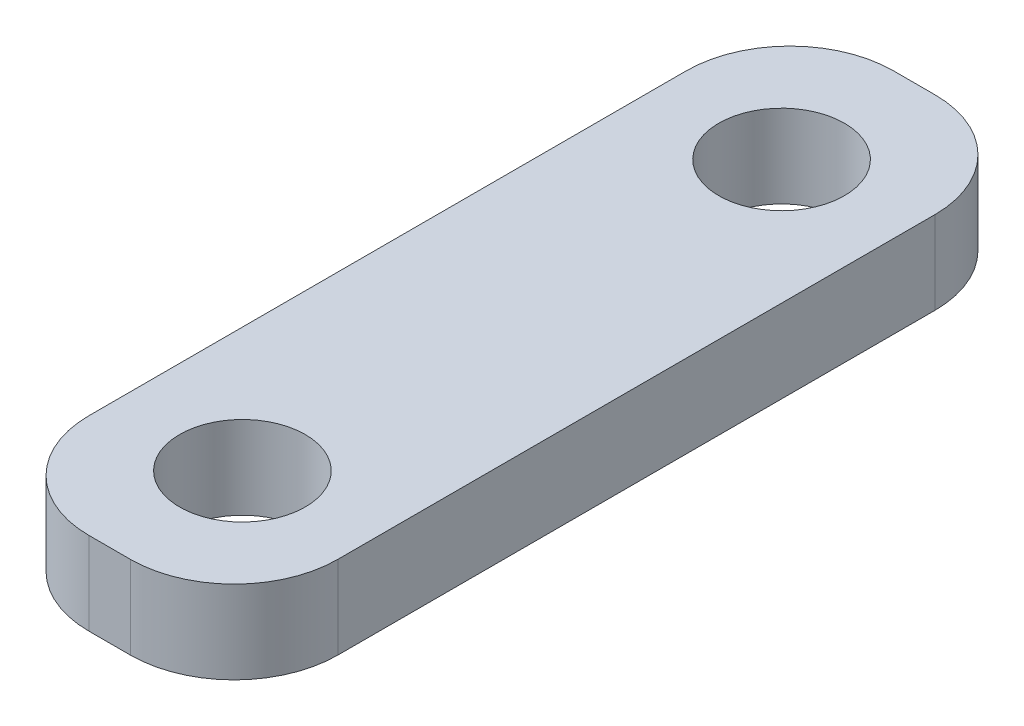
ISO-10303-21;
HEADER;
FILE_DESCRIPTION(('STEP AP214'),'2;1');
FILE_NAME('part.step','',(''),(''),'','','');
FILE_SCHEMA(('AUTOMOTIVE_DESIGN { 1 0 10303 214 1 1 1 1 }'));
ENDSEC;
DATA;
#1=APPLICATION_CONTEXT('core data for automotive mechanical design processes');
#2=APPLICATION_PROTOCOL_DEFINITION('international standard','automotive_design',2000,#1);
#3=PRODUCT_CONTEXT('',#1,'mechanical');
#4=PRODUCT('Part','Part','',(#3));
#5=PRODUCT_RELATED_PRODUCT_CATEGORY('part','',(#4));
#6=PRODUCT_DEFINITION_FORMATION('','',#4);
#7=PRODUCT_DEFINITION_CONTEXT('part definition',#1,'design');
#8=PRODUCT_DEFINITION('design','',#6,#7);
#9=PRODUCT_DEFINITION_SHAPE('','',#8);
#10=(LENGTH_UNIT() NAMED_UNIT(*) SI_UNIT(.MILLI.,.METRE.));
#11=(NAMED_UNIT(*) PLANE_ANGLE_UNIT() SI_UNIT($,.RADIAN.));
#12=(NAMED_UNIT(*) SI_UNIT($,.STERADIAN.) SOLID_ANGLE_UNIT());
#13=UNCERTAINTY_MEASURE_WITH_UNIT(LENGTH_MEASURE(1.E-05),#10,'distance_accuracy_value','');
#14=(GEOMETRIC_REPRESENTATION_CONTEXT(3) GLOBAL_UNCERTAINTY_ASSIGNED_CONTEXT((#13)) GLOBAL_UNIT_ASSIGNED_CONTEXT((#10,
#11,#12)) REPRESENTATION_CONTEXT('',''));
#15=CARTESIAN_POINT('',(0.,0.,0.));
#16=DIRECTION('',(0.,0.,1.));
#17=DIRECTION('',(1.,0.,0.));
#18=AXIS2_PLACEMENT_3D('',#15,#16,#17);
#19=CARTESIAN_POINT('',(0.,2.,0.));
#20=DIRECTION('',(0.,-1.,0.));
#21=DIRECTION('',(0.,0.,1.));
#22=AXIS2_PLACEMENT_3D('',#19,#20,#21);
#23=PLANE('',#22);
#24=DIRECTION('',(1.,0.,0.));
#25=VECTOR('',#24,1.);
#26=CARTESIAN_POINT('',(0.,2.,0.));
#27=LINE('',#26,#25);
#28=CARTESIAN_POINT('',(2.5,2.,0.));
#29=VERTEX_POINT('',#28);
#30=CARTESIAN_POINT('',(3.5,2.,0.));
#31=VERTEX_POINT('',#30);
#32=EDGE_CURVE('E189',#29,#31,#27,.T.);
#33=ORIENTED_EDGE('',*,*,#32,.F.);
#34=CARTESIAN_POINT('',(2.5,2.,2.5));
#35=DIRECTION('',(0.,1.,0.));
#36=DIRECTION('',(0.,0.,1.));
#37=AXIS2_PLACEMENT_3D('',#34,#35,#36);
#38=CIRCLE('',#37,2.5);
#39=CARTESIAN_POINT('',(0.,2.,2.5));
#40=VERTEX_POINT('',#39);
#41=EDGE_CURVE('E176',#40,#29,#38,.F.);
#42=ORIENTED_EDGE('',*,*,#41,.F.);
#43=DIRECTION('',(0.,0.,-1.));
#44=VECTOR('',#43,1.);
#45=CARTESIAN_POINT('',(0.,2.,0.));
#46=LINE('',#45,#44);
#47=CARTESIAN_POINT('',(0.,2.,16.9));
#48=VERTEX_POINT('',#47);
#49=EDGE_CURVE('E148',#48,#40,#46,.T.);
#50=ORIENTED_EDGE('',*,*,#49,.F.);
#51=CARTESIAN_POINT('',(2.5,2.,16.9));
#52=DIRECTION('',(0.,1.,0.));
#53=DIRECTION('',(0.,0.,1.));
#54=AXIS2_PLACEMENT_3D('',#51,#52,#53);
#55=CIRCLE('',#54,2.5);
#56=CARTESIAN_POINT('',(2.5,2.,19.4));
#57=VERTEX_POINT('',#56);
#58=EDGE_CURVE('E170',#57,#48,#55,.F.);
#59=ORIENTED_EDGE('',*,*,#58,.F.);
#60=DIRECTION('',(-1.,0.,0.));
#61=VECTOR('',#60,1.);
#62=CARTESIAN_POINT('',(0.,2.,19.4));
#63=LINE('',#62,#61);
#64=CARTESIAN_POINT('',(3.5,2.,19.4));
#65=VERTEX_POINT('',#64);
#66=EDGE_CURVE('E156',#65,#57,#63,.T.);
#67=ORIENTED_EDGE('',*,*,#66,.F.);
#68=CARTESIAN_POINT('',(3.5,2.,16.9));
#69=DIRECTION('',(0.,1.,0.));
#70=DIRECTION('',(0.,0.,1.));
#71=AXIS2_PLACEMENT_3D('',#68,#69,#70);
#72=CIRCLE('',#71,2.5);
#73=CARTESIAN_POINT('',(6.,2.,16.9));
#74=VERTEX_POINT('',#73);
#75=EDGE_CURVE('E173',#74,#65,#72,.F.);
#76=ORIENTED_EDGE('',*,*,#75,.F.);
#77=DIRECTION('',(0.,0.,1.));
#78=VECTOR('',#77,1.);
#79=CARTESIAN_POINT('',(6.,2.,0.));
#80=LINE('',#79,#78);
#81=CARTESIAN_POINT('',(6.,2.,2.5));
#82=VERTEX_POINT('',#81);
#83=EDGE_CURVE('E194',#82,#74,#80,.T.);
#84=ORIENTED_EDGE('',*,*,#83,.F.);
#85=CARTESIAN_POINT('',(3.5,2.,2.5));
#86=DIRECTION('',(0.,1.,0.));
#87=DIRECTION('',(0.,0.,1.));
#88=AXIS2_PLACEMENT_3D('',#85,#86,#87);
#89=CIRCLE('',#88,2.5);
#90=EDGE_CURVE('E117',#31,#82,#89,.F.);
#91=ORIENTED_EDGE('',*,*,#90,.F.);
#92=EDGE_LOOP('',(#33,#42,#50,#59,#67,#76,#84,#91));
#93=FACE_BOUND('',#92,.T.);
#94=CARTESIAN_POINT('',(3.,2.,16.2));
#95=DIRECTION('',(0.,-1.,0.));
#96=DIRECTION('',(0.,0.,-1.));
#97=AXIS2_PLACEMENT_3D('',#94,#95,#96);
#98=CIRCLE('',#97,1.515);
#99=CARTESIAN_POINT('',(3.,2.,14.685));
#100=VERTEX_POINT('',#99);
#101=EDGE_CURVE('E196',#100,#100,#98,.T.);
#102=ORIENTED_EDGE('',*,*,#101,.T.);
#103=EDGE_LOOP('',(#102));
#104=FACE_BOUND('',#103,.T.);
#105=CARTESIAN_POINT('',(3.,2.,3.2));
#106=DIRECTION('',(0.,-1.,0.));
#107=DIRECTION('',(0.,0.,-1.));
#108=AXIS2_PLACEMENT_3D('',#105,#106,#107);
#109=CIRCLE('',#108,1.515);
#110=CARTESIAN_POINT('',(3.,2.,1.685));
#111=VERTEX_POINT('',#110);
#112=EDGE_CURVE('E204',#111,#111,#109,.T.);
#113=ORIENTED_EDGE('',*,*,#112,.T.);
#114=EDGE_LOOP('',(#113));
#115=FACE_BOUND('',#114,.T.);
#116=ADVANCED_FACE('F47',(#93,#104,#115),#23,.F.);
#117=CARTESIAN_POINT('',(0.,0.,0.));
#118=DIRECTION('',(0.,-1.,0.));
#119=DIRECTION('',(0.,0.,1.));
#120=AXIS2_PLACEMENT_3D('',#117,#118,#119);
#121=PLANE('',#120);
#122=CARTESIAN_POINT('',(3.,0.,16.2));
#123=DIRECTION('',(0.,-1.,0.));
#124=DIRECTION('',(0.,0.,-1.));
#125=AXIS2_PLACEMENT_3D('',#122,#123,#124);
#126=CIRCLE('',#125,1.515);
#127=CARTESIAN_POINT('',(3.,0.,14.685));
#128=VERTEX_POINT('',#127);
#129=EDGE_CURVE('E199',#128,#128,#126,.T.);
#130=ORIENTED_EDGE('',*,*,#129,.F.);
#131=EDGE_LOOP('',(#130));
#132=FACE_BOUND('',#131,.T.);
#133=DIRECTION('',(0.,0.,1.));
#134=VECTOR('',#133,1.);
#135=CARTESIAN_POINT('',(6.,0.,0.));
#136=LINE('',#135,#134);
#137=CARTESIAN_POINT('',(6.,0.,2.5));
#138=VERTEX_POINT('',#137);
#139=CARTESIAN_POINT('',(6.,0.,16.9));
#140=VERTEX_POINT('',#139);
#141=EDGE_CURVE('E131',#138,#140,#136,.T.);
#142=ORIENTED_EDGE('',*,*,#141,.T.);
#143=CARTESIAN_POINT('',(3.5,0.,16.9));
#144=DIRECTION('',(0.,1.,0.));
#145=DIRECTION('',(0.,0.,1.));
#146=AXIS2_PLACEMENT_3D('',#143,#144,#145);
#147=CIRCLE('',#146,2.5);
#148=CARTESIAN_POINT('',(3.5,0.,19.4));
#149=VERTEX_POINT('',#148);
#150=EDGE_CURVE('E159',#149,#140,#147,.T.);
#151=ORIENTED_EDGE('',*,*,#150,.F.);
#152=DIRECTION('',(-1.,0.,0.));
#153=VECTOR('',#152,1.);
#154=CARTESIAN_POINT('',(0.,0.,19.4));
#155=LINE('',#154,#153);
#156=CARTESIAN_POINT('',(2.5,0.,19.4));
#157=VERTEX_POINT('',#156);
#158=EDGE_CURVE('E142',#149,#157,#155,.T.);
#159=ORIENTED_EDGE('',*,*,#158,.T.);
#160=CARTESIAN_POINT('',(2.5,0.,16.9));
#161=DIRECTION('',(0.,1.,0.));
#162=DIRECTION('',(0.,0.,1.));
#163=AXIS2_PLACEMENT_3D('',#160,#161,#162);
#164=CIRCLE('',#163,2.5);
#165=CARTESIAN_POINT('',(0.,0.,16.9));
#166=VERTEX_POINT('',#165);
#167=EDGE_CURVE('E123',#166,#157,#164,.T.);
#168=ORIENTED_EDGE('',*,*,#167,.F.);
#169=DIRECTION('',(0.,0.,-1.));
#170=VECTOR('',#169,1.);
#171=CARTESIAN_POINT('',(0.,0.,0.));
#172=LINE('',#171,#170);
#173=CARTESIAN_POINT('',(0.,0.,2.5));
#174=VERTEX_POINT('',#173);
#175=EDGE_CURVE('E151',#166,#174,#172,.T.);
#176=ORIENTED_EDGE('',*,*,#175,.T.);
#177=CARTESIAN_POINT('',(2.5,0.,2.5));
#178=DIRECTION('',(0.,1.,0.));
#179=DIRECTION('',(0.,0.,1.));
#180=AXIS2_PLACEMENT_3D('',#177,#178,#179);
#181=CIRCLE('',#180,2.5);
#182=CARTESIAN_POINT('',(2.5,0.,0.));
#183=VERTEX_POINT('',#182);
#184=EDGE_CURVE('E137',#183,#174,#181,.T.);
#185=ORIENTED_EDGE('',*,*,#184,.F.);
#186=DIRECTION('',(1.,0.,0.));
#187=VECTOR('',#186,1.);
#188=CARTESIAN_POINT('',(0.,0.,0.));
#189=LINE('',#188,#187);
#190=CARTESIAN_POINT('',(3.5,0.,0.));
#191=VERTEX_POINT('',#190);
#192=EDGE_CURVE('E134',#183,#191,#189,.T.);
#193=ORIENTED_EDGE('',*,*,#192,.T.);
#194=CARTESIAN_POINT('',(3.5,0.,2.5));
#195=DIRECTION('',(0.,1.,0.));
#196=DIRECTION('',(0.,0.,1.));
#197=AXIS2_PLACEMENT_3D('',#194,#195,#196);
#198=CIRCLE('',#197,2.5);
#199=EDGE_CURVE('E114',#138,#191,#198,.T.);
#200=ORIENTED_EDGE('',*,*,#199,.F.);
#201=EDGE_LOOP('',(#142,#151,#159,#168,#176,#185,#193,#200));
#202=FACE_BOUND('',#201,.T.);
#203=CARTESIAN_POINT('',(3.,0.,3.2));
#204=DIRECTION('',(0.,-1.,0.));
#205=DIRECTION('',(0.,0.,-1.));
#206=AXIS2_PLACEMENT_3D('',#203,#204,#205);
#207=CIRCLE('',#206,1.515);
#208=CARTESIAN_POINT('',(3.,0.,1.685));
#209=VERTEX_POINT('',#208);
#210=EDGE_CURVE('E201',#209,#209,#207,.T.);
#211=ORIENTED_EDGE('',*,*,#210,.F.);
#212=EDGE_LOOP('',(#211));
#213=FACE_BOUND('',#212,.T.);
#214=ADVANCED_FACE('F128',(#132,#202,#213),#121,.T.);
#215=CARTESIAN_POINT('',(0.,2.,0.));
#216=DIRECTION('',(1.,0.,0.));
#217=DIRECTION('',(0.,0.,1.));
#218=AXIS2_PLACEMENT_3D('',#215,#216,#217);
#219=PLANE('',#218);
#220=ORIENTED_EDGE('',*,*,#175,.F.);
#221=DIRECTION('',(0.,-1.,0.));
#222=VECTOR('',#221,1.);
#223=CARTESIAN_POINT('',(0.,2.,16.9));
#224=LINE('',#223,#222);
#225=EDGE_CURVE('E182',#48,#166,#224,.T.);
#226=ORIENTED_EDGE('',*,*,#225,.F.);
#227=ORIENTED_EDGE('',*,*,#49,.T.);
#228=DIRECTION('',(0.,-1.,0.));
#229=VECTOR('',#228,1.);
#230=CARTESIAN_POINT('',(0.,2.,2.5));
#231=LINE('',#230,#229);
#232=EDGE_CURVE('E185',#174,#40,#231,.F.);
#233=ORIENTED_EDGE('',*,*,#232,.F.);
#234=EDGE_LOOP('',(#220,#226,#227,#233));
#235=FACE_BOUND('',#234,.T.);
#236=ADVANCED_FACE('F228',(#235),#219,.F.);
#237=CARTESIAN_POINT('',(0.,2.,0.));
#238=DIRECTION('',(0.,0.,1.));
#239=DIRECTION('',(-1.,0.,0.));
#240=AXIS2_PLACEMENT_3D('',#237,#238,#239);
#241=PLANE('',#240);
#242=ORIENTED_EDGE('',*,*,#192,.F.);
#243=DIRECTION('',(0.,-1.,0.));
#244=VECTOR('',#243,1.);
#245=CARTESIAN_POINT('',(2.5,2.,0.));
#246=LINE('',#245,#244);
#247=EDGE_CURVE('E136',#29,#183,#246,.T.);
#248=ORIENTED_EDGE('',*,*,#247,.F.);
#249=ORIENTED_EDGE('',*,*,#32,.T.);
#250=DIRECTION('',(0.,-1.,0.));
#251=VECTOR('',#250,1.);
#252=CARTESIAN_POINT('',(3.5,2.,0.));
#253=LINE('',#252,#251);
#254=EDGE_CURVE('E167',#191,#31,#253,.F.);
#255=ORIENTED_EDGE('',*,*,#254,.F.);
#256=EDGE_LOOP('',(#242,#248,#249,#255));
#257=FACE_BOUND('',#256,.T.);
#258=ADVANCED_FACE('F235',(#257),#241,.F.);
#259=CARTESIAN_POINT('',(6.,2.,0.));
#260=DIRECTION('',(-1.,0.,0.));
#261=DIRECTION('',(0.,0.,-1.));
#262=AXIS2_PLACEMENT_3D('',#259,#260,#261);
#263=PLANE('',#262);
#264=ORIENTED_EDGE('',*,*,#83,.T.);
#265=DIRECTION('',(0.,-1.,0.));
#266=VECTOR('',#265,1.);
#267=CARTESIAN_POINT('',(6.,2.,16.9));
#268=LINE('',#267,#266);
#269=EDGE_CURVE('E124',#140,#74,#268,.F.);
#270=ORIENTED_EDGE('',*,*,#269,.F.);
#271=ORIENTED_EDGE('',*,*,#141,.F.);
#272=DIRECTION('',(0.,-1.,0.));
#273=VECTOR('',#272,1.);
#274=CARTESIAN_POINT('',(6.,2.,2.5));
#275=LINE('',#274,#273);
#276=EDGE_CURVE('E111',#82,#138,#275,.T.);
#277=ORIENTED_EDGE('',*,*,#276,.F.);
#278=EDGE_LOOP('',(#264,#270,#271,#277));
#279=FACE_BOUND('',#278,.T.);
#280=ADVANCED_FACE('F139',(#279),#263,.F.);
#281=CARTESIAN_POINT('',(0.,2.,19.4));
#282=DIRECTION('',(0.,0.,-1.));
#283=DIRECTION('',(1.,0.,0.));
#284=AXIS2_PLACEMENT_3D('',#281,#282,#283);
#285=PLANE('',#284);
#286=ORIENTED_EDGE('',*,*,#66,.T.);
#287=DIRECTION('',(0.,-1.,0.));
#288=VECTOR('',#287,1.);
#289=CARTESIAN_POINT('',(2.5,2.,19.4));
#290=LINE('',#289,#288);
#291=EDGE_CURVE('E56',#157,#57,#290,.F.);
#292=ORIENTED_EDGE('',*,*,#291,.F.);
#293=ORIENTED_EDGE('',*,*,#158,.F.);
#294=DIRECTION('',(0.,-1.,0.));
#295=VECTOR('',#294,1.);
#296=CARTESIAN_POINT('',(3.5,2.,19.4));
#297=LINE('',#296,#295);
#298=EDGE_CURVE('E11',#65,#149,#297,.T.);
#299=ORIENTED_EDGE('',*,*,#298,.F.);
#300=EDGE_LOOP('',(#286,#292,#293,#299));
#301=FACE_BOUND('',#300,.T.);
#302=ADVANCED_FACE('F243',(#301),#285,.F.);
#303=CARTESIAN_POINT('',(3.,2.,16.2));
#304=DIRECTION('',(0.,-1.,0.));
#305=DIRECTION('',(0.,0.,1.));
#306=AXIS2_PLACEMENT_3D('',#303,#304,#305);
#307=CYLINDRICAL_SURFACE('',#306,1.515);
#308=ORIENTED_EDGE('',*,*,#101,.F.);
#309=EDGE_LOOP('',(#308));
#310=FACE_BOUND('',#309,.T.);
#311=ORIENTED_EDGE('',*,*,#129,.T.);
#312=EDGE_LOOP('',(#311));
#313=FACE_BOUND('',#312,.T.);
#314=ADVANCED_FACE('F224',(#310,#313),#307,.F.);
#315=CARTESIAN_POINT('',(3.,2.,3.2));
#316=DIRECTION('',(0.,-1.,0.));
#317=DIRECTION('',(0.,0.,1.));
#318=AXIS2_PLACEMENT_3D('',#315,#316,#317);
#319=CYLINDRICAL_SURFACE('',#318,1.515);
#320=ORIENTED_EDGE('',*,*,#112,.F.);
#321=EDGE_LOOP('',(#320));
#322=FACE_BOUND('',#321,.T.);
#323=ORIENTED_EDGE('',*,*,#210,.T.);
#324=EDGE_LOOP('',(#323));
#325=FACE_BOUND('',#324,.T.);
#326=ADVANCED_FACE('F221',(#322,#325),#319,.F.);
#327=CARTESIAN_POINT('',(3.5,2.,2.5));
#328=DIRECTION('',(0.,-1.,0.));
#329=DIRECTION('',(0.,0.,1.));
#330=AXIS2_PLACEMENT_3D('',#327,#328,#329);
#331=CYLINDRICAL_SURFACE('',#330,2.5);
#332=ORIENTED_EDGE('',*,*,#90,.T.);
#333=ORIENTED_EDGE('',*,*,#276,.T.);
#334=ORIENTED_EDGE('',*,*,#199,.T.);
#335=ORIENTED_EDGE('',*,*,#254,.T.);
#336=EDGE_LOOP('',(#332,#333,#334,#335));
#337=FACE_BOUND('',#336,.T.);
#338=ADVANCED_FACE('F113',(#337),#331,.T.);
#339=CARTESIAN_POINT('',(2.5,2.,2.5));
#340=DIRECTION('',(0.,-1.,0.));
#341=DIRECTION('',(0.,0.,1.));
#342=AXIS2_PLACEMENT_3D('',#339,#340,#341);
#343=CYLINDRICAL_SURFACE('',#342,2.5);
#344=ORIENTED_EDGE('',*,*,#41,.T.);
#345=ORIENTED_EDGE('',*,*,#247,.T.);
#346=ORIENTED_EDGE('',*,*,#184,.T.);
#347=ORIENTED_EDGE('',*,*,#232,.T.);
#348=EDGE_LOOP('',(#344,#345,#346,#347));
#349=FACE_BOUND('',#348,.T.);
#350=ADVANCED_FACE('F253',(#349),#343,.T.);
#351=CARTESIAN_POINT('',(3.5,2.,16.9));
#352=DIRECTION('',(0.,-1.,0.));
#353=DIRECTION('',(0.,0.,1.));
#354=AXIS2_PLACEMENT_3D('',#351,#352,#353);
#355=CYLINDRICAL_SURFACE('',#354,2.5);
#356=ORIENTED_EDGE('',*,*,#75,.T.);
#357=ORIENTED_EDGE('',*,*,#298,.T.);
#358=ORIENTED_EDGE('',*,*,#150,.T.);
#359=ORIENTED_EDGE('',*,*,#269,.T.);
#360=EDGE_LOOP('',(#356,#357,#358,#359));
#361=FACE_BOUND('',#360,.T.);
#362=ADVANCED_FACE('F255',(#361),#355,.T.);
#363=CARTESIAN_POINT('',(2.5,2.,16.9));
#364=DIRECTION('',(0.,-1.,0.));
#365=DIRECTION('',(0.,0.,1.));
#366=AXIS2_PLACEMENT_3D('',#363,#364,#365);
#367=CYLINDRICAL_SURFACE('',#366,2.5);
#368=ORIENTED_EDGE('',*,*,#58,.T.);
#369=ORIENTED_EDGE('',*,*,#225,.T.);
#370=ORIENTED_EDGE('',*,*,#167,.T.);
#371=ORIENTED_EDGE('',*,*,#291,.T.);
#372=EDGE_LOOP('',(#368,#369,#370,#371));
#373=FACE_BOUND('',#372,.T.);
#374=ADVANCED_FACE('F49',(#373),#367,.T.);
#375=CLOSED_SHELL('',(#116,#214,#236,#258,#280,#302,#314,#326,#338,#350,#362,#374));
#376=MANIFOLD_SOLID_BREP('B2',#375);
#377=ADVANCED_BREP_SHAPE_REPRESENTATION('',(#18,#376),#14);
#378=SHAPE_DEFINITION_REPRESENTATION(#9,#377);
ENDSEC;
END-ISO-10303-21;
